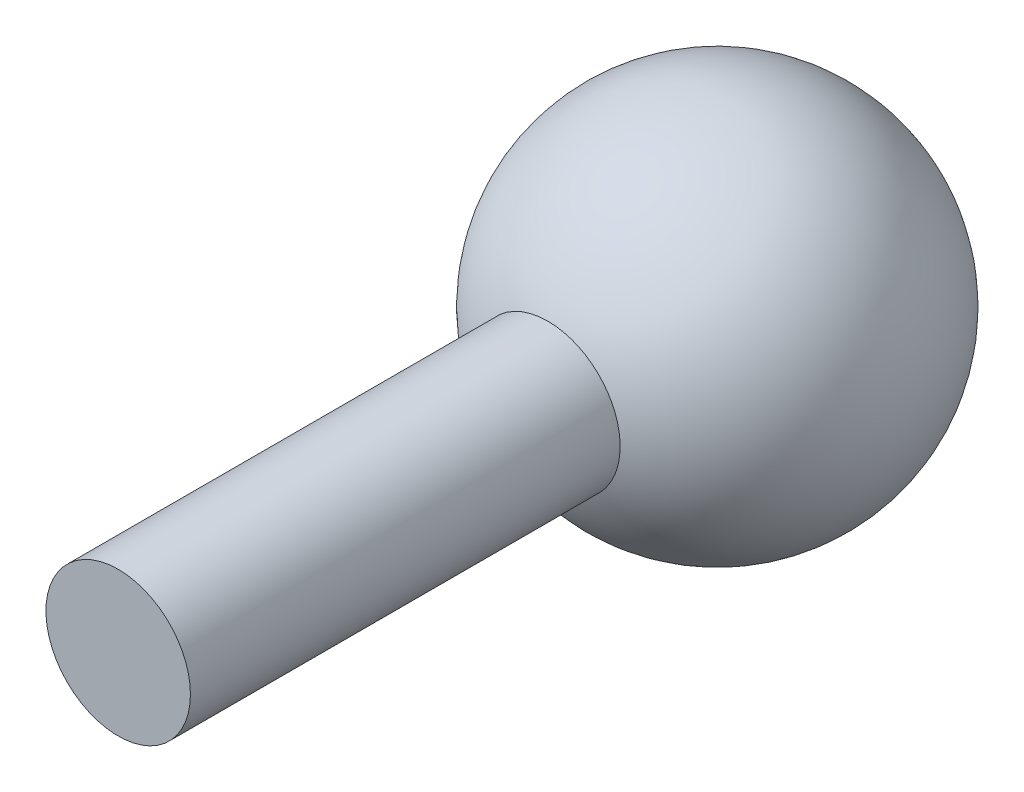
ISO-10303-21;
HEADER;
FILE_DESCRIPTION(('STEP AP214'),'2;1');
FILE_NAME('part.step','',(''),(''),'','','');
FILE_SCHEMA(('AUTOMOTIVE_DESIGN { 1 0 10303 214 1 1 1 1 }'));
ENDSEC;
DATA;
#1=APPLICATION_CONTEXT('core data for automotive mechanical design processes');
#2=APPLICATION_PROTOCOL_DEFINITION('international standard','automotive_design',2000,#1);
#3=PRODUCT_CONTEXT('',#1,'mechanical');
#4=PRODUCT('Part','Part','',(#3));
#5=PRODUCT_RELATED_PRODUCT_CATEGORY('part','',(#4));
#6=PRODUCT_DEFINITION_FORMATION('','',#4);
#7=PRODUCT_DEFINITION_CONTEXT('part definition',#1,'design');
#8=PRODUCT_DEFINITION('design','',#6,#7);
#9=PRODUCT_DEFINITION_SHAPE('','',#8);
#10=(LENGTH_UNIT() NAMED_UNIT(*) SI_UNIT(.MILLI.,.METRE.));
#11=(NAMED_UNIT(*) PLANE_ANGLE_UNIT() SI_UNIT($,.RADIAN.));
#12=(NAMED_UNIT(*) SI_UNIT($,.STERADIAN.) SOLID_ANGLE_UNIT());
#13=UNCERTAINTY_MEASURE_WITH_UNIT(LENGTH_MEASURE(1.E-05),#10,'distance_accuracy_value','');
#14=(GEOMETRIC_REPRESENTATION_CONTEXT(3) GLOBAL_UNCERTAINTY_ASSIGNED_CONTEXT((#13)) GLOBAL_UNIT_ASSIGNED_CONTEXT((#10,
#11,#12)) REPRESENTATION_CONTEXT('',''));
#15=CARTESIAN_POINT('',(0.,0.,0.));
#16=DIRECTION('',(0.,0.,1.));
#17=DIRECTION('',(1.,0.,0.));
#18=AXIS2_PLACEMENT_3D('',#15,#16,#17);
#19=CARTESIAN_POINT('',(0.,0.,-35.8580562570614));
#20=DIRECTION('',(0.,0.,-1.));
#21=DIRECTION('',(-1.,0.,0.));
#22=AXIS2_PLACEMENT_3D('',#19,#20,#21);
#23=SPHERICAL_SURFACE('',#22,51.0330195123021);
#24=CARTESIAN_POINT('',(0.,0.,-86.8910757693635));
#25=VERTEX_POINT('',#24);
#26=VERTEX_LOOP('',#25);
#27=FACE_BOUND('',#26,.T.);
#28=ADVANCED_FACE('F42',(#27),#23,.T.);
#29=CLOSED_SHELL('',(#28));
#30=CARTESIAN_POINT('',(0.,0.,-35.8580562570614));
#31=DIRECTION('',(0.,0.,-1.));
#32=DIRECTION('',(-1.,0.,0.));
#33=AXIS2_PLACEMENT_3D('',#30,#31,#32);
#34=SPHERICAL_SURFACE('',#33,41.0584972756503);
#35=CARTESIAN_POINT('',(0.,0.,-76.9165535327117));
#36=VERTEX_POINT('',#35);
#37=VERTEX_LOOP('',#36);
#38=FACE_BOUND('',#37,.T.);
#39=ADVANCED_FACE('F55',(#38),#34,.F.);
#40=CLOSED_SHELL('',(#39));
#41=ORIENTED_CLOSED_SHELL('',*,#40,.T.);
#42=BREP_WITH_VOIDS('B2',#29,(#41));
#43=CARTESIAN_POINT('',(0.,20.,0.));
#44=DIRECTION('',(1.,0.,0.));
#45=DIRECTION('',(0.,0.,-1.));
#46=AXIS2_PLACEMENT_3D('',#43,#44,#45);
#47=PLANE('',#46);
#48=DIRECTION('',(0.,0.,1.));
#49=VECTOR('',#48,1.);
#50=CARTESIAN_POINT('',(0.,-20.,0.));
#51=LINE('',#50,#49);
#52=CARTESIAN_POINT('',(0.,-20.,-76.9165535327117));
#53=VERTEX_POINT('',#52);
#54=CARTESIAN_POINT('',(0.,-20.,-55.8580562570614));
#55=VERTEX_POINT('',#54);
#56=EDGE_CURVE('E134',#53,#55,#51,.T.);
#57=ORIENTED_EDGE('',*,*,#56,.T.);
#58=DIRECTION('',(0.,1.,0.));
#59=VECTOR('',#58,1.);
#60=CARTESIAN_POINT('',(0.,-20.,-55.8580562570614));
#61=LINE('',#60,#59);
#62=CARTESIAN_POINT('',(0.,20.,-55.8580562570614));
#63=VERTEX_POINT('',#62);
#64=EDGE_CURVE('E82',#55,#63,#61,.T.);
#65=ORIENTED_EDGE('',*,*,#64,.T.);
#66=DIRECTION('',(0.,0.,1.));
#67=VECTOR('',#66,1.);
#68=CARTESIAN_POINT('',(0.,20.,0.));
#69=LINE('',#68,#67);
#70=CARTESIAN_POINT('',(0.,20.,-76.9165535327117));
#71=VERTEX_POINT('',#70);
#72=EDGE_CURVE('E186',#71,#63,#69,.T.);
#73=ORIENTED_EDGE('',*,*,#72,.F.);
#74=DIRECTION('',(0.,-1.,0.));
#75=VECTOR('',#74,1.);
#76=CARTESIAN_POINT('',(0.,20.,-76.9165535327117));
#77=LINE('',#76,#75);
#78=EDGE_CURVE('E143',#71,#53,#77,.T.);
#79=ORIENTED_EDGE('',*,*,#78,.T.);
#80=EDGE_LOOP('',(#57,#65,#73,#79));
#81=FACE_BOUND('',#80,.T.);
#82=ADVANCED_FACE('F66',(#81),#47,.F.);
#83=CARTESIAN_POINT('',(0.,0.,130.));
#84=DIRECTION('',(0.,0.,-1.));
#85=DIRECTION('',(-1.,0.,0.));
#86=AXIS2_PLACEMENT_3D('',#83,#84,#85);
#87=CYLINDRICAL_SURFACE('',#86,20.);
#88=CARTESIAN_POINT('',(0.,0.,130.));
#89=DIRECTION('',(0.,0.,1.));
#90=DIRECTION('',(1.,0.,0.));
#91=AXIS2_PLACEMENT_3D('',#88,#89,#90);
#92=CIRCLE('',#91,20.);
#93=CARTESIAN_POINT('',(20.,0.,130.));
#94=VERTEX_POINT('',#93);
#95=EDGE_CURVE('E75',#94,#94,#92,.T.);
#96=ORIENTED_EDGE('',*,*,#95,.F.);
#97=EDGE_LOOP('',(#96));
#98=FACE_BOUND('',#97,.T.);
#99=CARTESIAN_POINT('',(0.,20.,0.));
#100=VERTEX_POINT('',#99);
#101=CARTESIAN_POINT('',(0.,20.,5.20044101858887));
#102=VERTEX_POINT('',#101);
#103=EDGE_CURVE('E142',#100,#102,#69,.T.);
#104=ORIENTED_EDGE('',*,*,#103,.F.);
#105=CARTESIAN_POINT('',(0.,0.,0.));
#106=DIRECTION('',(0.,0.,1.));
#107=DIRECTION('',(1.,0.,0.));
#108=AXIS2_PLACEMENT_3D('',#105,#106,#107);
#109=CIRCLE('',#108,20.);
#110=CARTESIAN_POINT('',(0.,-20.,0.));
#111=VERTEX_POINT('',#110);
#112=EDGE_CURVE('E152',#100,#111,#109,.T.);
#113=ORIENTED_EDGE('',*,*,#112,.T.);
#114=CARTESIAN_POINT('',(0.,-20.,5.20044101858887));
#115=VERTEX_POINT('',#114);
#116=EDGE_CURVE('E133',#111,#115,#51,.T.);
#117=ORIENTED_EDGE('',*,*,#116,.T.);
#118=CARTESIAN_POINT('',(0.,20.,5.20044101858887));
#119=CARTESIAN_POINT('',(0.264809376912151,20.0000013435151,5.20044411932189));
#120=CARTESIAN_POINT('',(0.529583273973028,19.9947396237404,5.19787832300058));
#121=CARTESIAN_POINT('',(1.05860408840214,19.9737187015619,5.18764407377799));
#122=CARTESIAN_POINT('',(1.32285102774968,19.9579599465784,5.17997583836038));
#123=CARTESIAN_POINT('',(2.11382956880206,19.8950060246265,5.14938228967504));
#124=CARTESIAN_POINT('',(2.63912298603863,19.8321331251802,5.11886804853914));
#125=CARTESIAN_POINT('',(3.67925830009679,19.6656903849372,5.03857350532012));
#126=CARTESIAN_POINT('',(4.19413587370425,19.5622998377473,4.98887809576056));
#127=CARTESIAN_POINT('',(5.21227659958056,19.3159640687202,4.87147780183019));
#128=CARTESIAN_POINT('',(5.71553906321576,19.1730165081305,4.80377185262075));
#129=CARTESIAN_POINT('',(6.70646899320425,18.8492626985781,4.65212133806968));
#130=CARTESIAN_POINT('',(7.19415483490184,18.6685031120067,4.56819679711157));
#131=CARTESIAN_POINT('',(8.15178853775043,18.2706633918214,4.38602486522363));
#132=CARTESIAN_POINT('',(8.62173513940603,18.0535806851694,4.28777645969088));
#133=CARTESIAN_POINT('',(9.31152587698891,17.7020404765632,4.13133539643534));
#134=CARTESIAN_POINT('',(9.53906228673903,17.58046292861,4.07764315749117));
#135=CARTESIAN_POINT('',(9.98871089784596,17.328935153557,3.96755618192996));
#136=CARTESIAN_POINT('',(10.2108244999792,17.1989871208959,3.91116215460962));
#137=CARTESIAN_POINT('',(10.8687678924583,16.7968478665336,3.73835319690657));
#138=CARTESIAN_POINT('',(11.296211342974,16.5123558362736,3.61830885578252));
#139=CARTESIAN_POINT('',(12.1506083471962,15.8951668992024,3.36404160631511));
#140=CARTESIAN_POINT('',(12.5761078484108,15.5606348947435,3.2294002397752));
#141=CARTESIAN_POINT('',(13.3977872699973,14.8590424930547,2.95543439385234));
#142=CARTESIAN_POINT('',(13.7939662147408,14.4919810143133,2.81610975885985));
#143=CARTESIAN_POINT('',(14.5552662647277,13.7271794598092,2.53607089610926));
#144=CARTESIAN_POINT('',(14.9203767131894,13.3294289459112,2.39535620987484));
#145=CARTESIAN_POINT('',(15.6177586885265,12.5050883955467,2.11597436824213));
#146=CARTESIAN_POINT('',(15.9500141272717,12.0784844008676,1.97730824395569));
#147=CARTESIAN_POINT('',(16.6026297405821,11.1664489781176,1.69574820925625));
#148=CARTESIAN_POINT('',(16.9203576050841,10.6789961454079,1.55328286385053));
#149=CARTESIAN_POINT('',(17.5131657235314,9.67616220030065,1.27946957181443));
#150=CARTESIAN_POINT('',(17.7882671385866,9.16079511801471,1.14811612368907));
#151=CARTESIAN_POINT('',(18.2934759188271,8.1050039660713,0.900997668925349));
#152=CARTESIAN_POINT('',(18.5235955614222,7.56458678359526,0.785228411402));
#153=CARTESIAN_POINT('',(18.936393374726,6.4621458696626,0.57362074429925));
#154=CARTESIAN_POINT('',(19.1190765307703,5.90012441583894,0.477780240519388));
#155=CARTESIAN_POINT('',(19.4254148411903,4.79208670147786,0.314886607028547));
#156=CARTESIAN_POINT('',(19.5518928310206,4.2470507712675,0.246479793682584));
#157=CARTESIAN_POINT('',(19.7589801577907,3.1458691433616,0.133566112953747));
#158=CARTESIAN_POINT('',(19.8395913613752,2.58972389873645,0.0890582729563731));
#159=CARTESIAN_POINT('',(19.9536978566931,1.47157310859828,0.0258456842675963));
#160=CARTESIAN_POINT('',(19.9872284312217,0.909572269889811,0.00712161310977638));
#161=CARTESIAN_POINT('',(20.0067492280901,-0.215489422501835,-0.00376295437196837));
#162=CARTESIAN_POINT('',(19.9927435878908,-0.778550179668415,0.00407423746263314));
#163=CARTESIAN_POINT('',(19.9216697978978,-1.83746890075332,0.0435955778665291));
#164=CARTESIAN_POINT('',(19.8696107039039,-2.33377729269279,0.0725048119319287));
#165=CARTESIAN_POINT('',(19.7288695840069,-3.31957205916918,0.149975605951904));
#166=CARTESIAN_POINT('',(19.640190767508,-3.80905902765994,0.198535443692387));
#167=CARTESIAN_POINT('',(19.427191444983,-4.7781202000572,0.313742867292923));
#168=CARTESIAN_POINT('',(19.302863608923,-5.25769234354592,0.380394172910454));
#169=CARTESIAN_POINT('',(19.0198352118413,-6.2040158666757,0.529738908066295));
#170=CARTESIAN_POINT('',(18.8611329007179,-6.67076659217822,0.612433154373735));
#171=CARTESIAN_POINT('',(18.5067309294048,-7.59958315138082,0.793568402225422));
#172=CARTESIAN_POINT('',(18.310262717738,-8.061292940532,0.892328463594756));
#173=CARTESIAN_POINT('',(17.8843341793257,-8.9666592412699,1.10147660197443));
#174=CARTESIAN_POINT('',(17.6548628567725,-9.4103096724727,1.21186855114712));
#175=CARTESIAN_POINT('',(17.164474897238,-10.277598250764,1.44146502993262));
#176=CARTESIAN_POINT('',(16.9035517693417,-10.701232241732,1.56067137666129));
#177=CARTESIAN_POINT('',(16.351786136912,-11.5267343936781,1.80506008554959));
#178=CARTESIAN_POINT('',(16.0609418558863,-11.9286012601238,1.93024280230423));
#179=CARTESIAN_POINT('',(15.4142071557447,-12.7557765525824,2.19899618612489));
#180=CARTESIAN_POINT('',(15.0546981657794,-13.17812964073,2.34297373502157));
#181=CARTESIAN_POINT('',(14.3020212494191,-13.9913941899633,2.63109447389873));
#182=CARTESIAN_POINT('',(13.9088619970711,-14.3823137036097,2.77523761180019));
#183=CARTESIAN_POINT('',(13.0904821804448,-15.1309953972837,3.06015668189145));
#184=CARTESIAN_POINT('',(12.6652405687723,-15.4887354610641,3.20093032237334));
#185=CARTESIAN_POINT('',(11.7850236806993,-16.1685635098096,3.47546555728889));
#186=CARTESIAN_POINT('',(11.3300487446357,-16.4906519027414,3.60922723195214));
#187=CARTESIAN_POINT('',(10.3726858599663,-17.1098223901317,3.87183525370747));
#188=CARTESIAN_POINT('',(9.8691037631527,-17.4052545564412,4.00022941688249));
#189=CARTESIAN_POINT('',(8.83510970998861,-17.9522396752563,4.24210473023196));
#190=CARTESIAN_POINT('',(8.30469474391176,-18.2037876913277,4.35558420233107));
#191=CARTESIAN_POINT('',(7.22152407308682,-18.6599686280205,4.56413479808821));
#192=CARTESIAN_POINT('',(6.66880325518474,-18.86467170686,4.65923341654443));
#193=CARTESIAN_POINT('',(5.54459785841745,-19.2251278915305,4.82830932967158));
#194=CARTESIAN_POINT('',(4.97312062655324,-19.3808999170675,4.90229478695288));
#195=CARTESIAN_POINT('',(4.03587428700296,-19.5920191972346,5.00320261542509));
#196=CARTESIAN_POINT('',(3.67432529000502,-19.6630447272557,5.03733073906607));
#197=CARTESIAN_POINT('',(2.9471742990353,-19.7850951937515,5.09615379756865));
#198=CARTESIAN_POINT('',(2.58157342804043,-19.8361255360664,5.12085128202414));
#199=CARTESIAN_POINT('',(1.84741190947579,-19.9179194011573,5.16050496322526));
#200=CARTESIAN_POINT('',(1.47884992208359,-19.9486731579,5.17545646586794));
#201=CARTESIAN_POINT('',(0.740196032775427,-19.9897273510739,5.19543747985078));
#202=CARTESIAN_POINT('',(0.370103653466842,-20.0000208325826,5.20046361732513));
#203=CARTESIAN_POINT('',(0.,-20.,5.20044101858886));
#204=B_SPLINE_CURVE_WITH_KNOTS('',3,(#118,#119,#120,#121,#122,#123,#124,#125,#126,#127,#128,
#129,#130,#131,#132,#133,#134,#135,#136,#137,#138,#139,#140,#141,#142,#143,#144,#145,#146,#147,
#148,#149,#150,#151,#152,#153,#154,#155,#156,#157,#158,#159,#160,#161,#162,#163,#164,#165,#166,
#167,#168,#169,#170,#171,#172,#173,#174,#175,#176,#177,#178,#179,#180,#181,#182,#183,#184,#185,
#186,#187,#188,#189,#190,#191,#192,#193,#194,#195,#196,#197,#198,#199,#200,#201,#202,#203),
.UNSPECIFIED.,.F.,.F.,(4,2,2,2,2,2,2,2,2,2,2,2,2,2,2,2,2,2,2,2,2,2,2,2,2,2,2,2,2,2,2,2,2,2,2,2,
2,2,2,2,2,2,4),(0.,0.794293040842823,1.58855222832837,3.17610174302734,4.75670414818708,
6.33740002421297,7.91615661107771,9.4950250804577,10.2853775057566,11.0755235659334,
12.6557777247429,14.3272982271529,15.9988743236779,17.671021494276,19.3439834530326,
21.1388878037916,22.932898232924,24.7264183156382,26.5197498320773,28.2084149140841,
29.897011267421,31.5843414895035,33.2715248533661,34.7693650750565,36.267074051769,
37.7650912035721,39.2631846416016,40.7958132477732,42.3289536753355,43.862411050586,
45.3959595235699,47.1131434464186,48.8298860552699,50.5477648813179,52.2656240474249,
54.0566688189231,55.8479149314921,57.6364605321944,59.4243137192454,60.5338173771238,
61.6430208655354,62.7527582022277,63.8628726999365),.UNSPECIFIED.);
#205=EDGE_CURVE('E90',#102,#115,#204,.T.);
#206=ORIENTED_EDGE('',*,*,#205,.F.);
#207=EDGE_LOOP('',(#104,#113,#117,#206));
#208=FACE_BOUND('',#207,.T.);
#209=ADVANCED_FACE('F68',(#98,#208),#87,.T.);
#210=CARTESIAN_POINT('',(0.,0.,0.));
#211=DIRECTION('',(0.,0.,1.));
#212=DIRECTION('',(1.,0.,0.));
#213=AXIS2_PLACEMENT_3D('',#210,#211,#212);
#214=PLANE('',#213);
#215=DIRECTION('',(0.,1.,0.));
#216=VECTOR('',#215,1.);
#217=CARTESIAN_POINT('',(0.,0.,0.));
#218=LINE('',#217,#216);
#219=EDGE_CURVE('E39',#111,#100,#218,.T.);
#220=ORIENTED_EDGE('',*,*,#219,.F.);
#221=ORIENTED_EDGE('',*,*,#112,.F.);
#222=EDGE_LOOP('',(#220,#221));
#223=FACE_BOUND('',#222,.T.);
#224=ADVANCED_FACE('F165',(#223),#214,.F.);
#225=CARTESIAN_POINT('',(0.,0.,130.));
#226=DIRECTION('',(0.,0.,1.));
#227=DIRECTION('',(1.,0.,0.));
#228=AXIS2_PLACEMENT_3D('',#225,#226,#227);
#229=PLANE('',#228);
#230=ORIENTED_EDGE('',*,*,#95,.T.);
#231=EDGE_LOOP('',(#230));
#232=FACE_BOUND('',#231,.T.);
#233=ADVANCED_FACE('F163',(#232),#229,.T.);
#234=CARTESIAN_POINT('',(0.,20.,-15.8580562570614));
#235=VERTEX_POINT('',#234);
#236=EDGE_CURVE('E128',#235,#100,#69,.T.);
#237=ORIENTED_EDGE('',*,*,#236,.F.);
#238=DIRECTION('',(0.,1.,0.));
#239=VECTOR('',#238,1.);
#240=CARTESIAN_POINT('',(0.,-20.,-15.8580562570614));
#241=LINE('',#240,#239);
#242=CARTESIAN_POINT('',(0.,-20.,-15.8580562570614));
#243=VERTEX_POINT('',#242);
#244=EDGE_CURVE('E115',#235,#243,#241,.F.);
#245=ORIENTED_EDGE('',*,*,#244,.T.);
#246=EDGE_CURVE('E126',#243,#111,#51,.T.);
#247=ORIENTED_EDGE('',*,*,#246,.T.);
#248=ORIENTED_EDGE('',*,*,#219,.T.);
#249=EDGE_LOOP('',(#237,#245,#247,#248));
#250=FACE_BOUND('',#249,.T.);
#251=ADVANCED_FACE('F125',(#250),#47,.F.);
#252=CARTESIAN_POINT('',(0.,20.,-35.8580562570614));
#253=DIRECTION('',(0.,-1.,0.));
#254=DIRECTION('',(0.,0.,-1.));
#255=AXIS2_PLACEMENT_3D('',#252,#253,#254);
#256=CYLINDRICAL_SURFACE('',#255,41.0584972756503);
#257=CARTESIAN_POINT('',(0.,20.,-35.8580562570614));
#258=DIRECTION('',(0.,1.,0.));
#259=DIRECTION('',(0.,0.,1.));
#260=AXIS2_PLACEMENT_3D('',#257,#258,#259);
#261=CIRCLE('',#260,41.0584972756503);
#262=EDGE_CURVE('E139',#102,#71,#261,.T.);
#263=ORIENTED_EDGE('',*,*,#262,.F.);
#264=ORIENTED_EDGE('',*,*,#205,.T.);
#265=CARTESIAN_POINT('',(0.,-20.,-35.8580562570614));
#266=DIRECTION('',(0.,1.,0.));
#267=DIRECTION('',(0.,0.,1.));
#268=AXIS2_PLACEMENT_3D('',#265,#266,#267);
#269=CIRCLE('',#268,41.0584972756503);
#270=EDGE_CURVE('E136',#115,#53,#269,.T.);
#271=ORIENTED_EDGE('',*,*,#270,.T.);
#272=ORIENTED_EDGE('',*,*,#78,.F.);
#273=EDGE_LOOP('',(#263,#264,#271,#272));
#274=FACE_BOUND('',#273,.T.);
#275=ADVANCED_FACE('F153',(#274),#256,.T.);
#276=CARTESIAN_POINT('',(0.,20.,0.));
#277=DIRECTION('',(0.,1.,0.));
#278=DIRECTION('',(0.,0.,1.));
#279=AXIS2_PLACEMENT_3D('',#276,#277,#278);
#280=PLANE('',#279);
#281=CARTESIAN_POINT('',(0.,20.,-35.8580562570614));
#282=DIRECTION('',(0.,1.,0.));
#283=DIRECTION('',(0.,0.,1.));
#284=AXIS2_PLACEMENT_3D('',#281,#282,#283);
#285=CIRCLE('',#284,20.);
#286=EDGE_CURVE('E121',#235,#63,#285,.T.);
#287=ORIENTED_EDGE('',*,*,#286,.F.);
#288=ORIENTED_EDGE('',*,*,#236,.T.);
#289=ORIENTED_EDGE('',*,*,#103,.T.);
#290=ORIENTED_EDGE('',*,*,#262,.T.);
#291=ORIENTED_EDGE('',*,*,#72,.T.);
#292=EDGE_LOOP('',(#287,#288,#289,#290,#291));
#293=FACE_BOUND('',#292,.T.);
#294=ADVANCED_FACE('F158',(#293),#280,.T.);
#295=CARTESIAN_POINT('',(0.,-20.,0.));
#296=DIRECTION('',(0.,1.,0.));
#297=DIRECTION('',(0.,0.,1.));
#298=AXIS2_PLACEMENT_3D('',#295,#296,#297);
#299=PLANE('',#298);
#300=ORIENTED_EDGE('',*,*,#246,.F.);
#301=CARTESIAN_POINT('',(0.,-20.,-35.8580562570614));
#302=DIRECTION('',(0.,1.,0.));
#303=DIRECTION('',(0.,0.,1.));
#304=AXIS2_PLACEMENT_3D('',#301,#302,#303);
#305=CIRCLE('',#304,20.);
#306=EDGE_CURVE('E112',#243,#55,#305,.T.);
#307=ORIENTED_EDGE('',*,*,#306,.T.);
#308=ORIENTED_EDGE('',*,*,#56,.F.);
#309=ORIENTED_EDGE('',*,*,#270,.F.);
#310=ORIENTED_EDGE('',*,*,#116,.F.);
#311=EDGE_LOOP('',(#300,#307,#308,#309,#310));
#312=FACE_BOUND('',#311,.T.);
#313=ADVANCED_FACE('F131',(#312),#299,.F.);
#314=CARTESIAN_POINT('',(0.,-20.,-35.8580562570614));
#315=DIRECTION('',(0.,1.,0.));
#316=DIRECTION('',(0.,0.,1.));
#317=AXIS2_PLACEMENT_3D('',#314,#315,#316);
#318=CYLINDRICAL_SURFACE('',#317,20.);
#319=ORIENTED_EDGE('',*,*,#306,.F.);
#320=ORIENTED_EDGE('',*,*,#244,.F.);
#321=ORIENTED_EDGE('',*,*,#286,.T.);
#322=ORIENTED_EDGE('',*,*,#64,.F.);
#323=EDGE_LOOP('',(#319,#320,#321,#322));
#324=FACE_BOUND('',#323,.T.);
#325=ADVANCED_FACE('F114',(#324),#318,.F.);
#326=CLOSED_SHELL('',(#82,#209,#224,#233,#251,#275,#294,#313,#325));
#327=MANIFOLD_SOLID_BREP('B6',#326);
#328=ADVANCED_BREP_SHAPE_REPRESENTATION('',(#18,#42,#327),#14);
#329=SHAPE_DEFINITION_REPRESENTATION(#9,#328);
ENDSEC;
END-ISO-10303-21;
